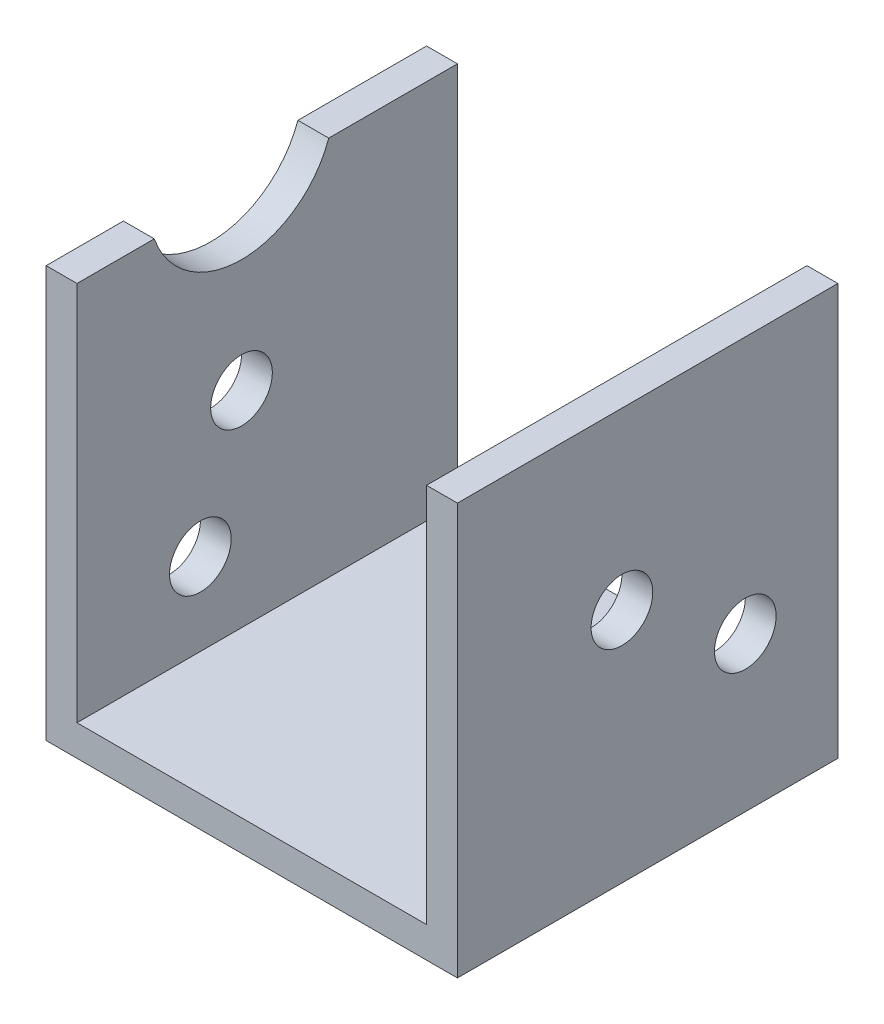
ISO-10303-21;
HEADER;
FILE_DESCRIPTION(('STEP AP214'),'2;1');
FILE_NAME('part.step','',(''),(''),'','','');
FILE_SCHEMA(('AUTOMOTIVE_DESIGN { 1 0 10303 214 1 1 1 1 }'));
ENDSEC;
DATA;
#1=APPLICATION_CONTEXT('core data for automotive mechanical design processes');
#2=APPLICATION_PROTOCOL_DEFINITION('international standard','automotive_design',2000,#1);
#3=PRODUCT_CONTEXT('',#1,'mechanical');
#4=PRODUCT('Part','Part','',(#3));
#5=PRODUCT_RELATED_PRODUCT_CATEGORY('part','',(#4));
#6=PRODUCT_DEFINITION_FORMATION('','',#4);
#7=PRODUCT_DEFINITION_CONTEXT('part definition',#1,'design');
#8=PRODUCT_DEFINITION('design','',#6,#7);
#9=PRODUCT_DEFINITION_SHAPE('','',#8);
#10=(LENGTH_UNIT() NAMED_UNIT(*) SI_UNIT(.MILLI.,.METRE.));
#11=(NAMED_UNIT(*) PLANE_ANGLE_UNIT() SI_UNIT($,.RADIAN.));
#12=(NAMED_UNIT(*) SI_UNIT($,.STERADIAN.) SOLID_ANGLE_UNIT());
#13=UNCERTAINTY_MEASURE_WITH_UNIT(LENGTH_MEASURE(1.E-05),#10,'distance_accuracy_value','');
#14=(GEOMETRIC_REPRESENTATION_CONTEXT(3) GLOBAL_UNCERTAINTY_ASSIGNED_CONTEXT((#13)) GLOBAL_UNIT_ASSIGNED_CONTEXT((#10,
#11,#12)) REPRESENTATION_CONTEXT('',''));
#15=CARTESIAN_POINT('',(0.,0.,0.));
#16=DIRECTION('',(0.,0.,1.));
#17=DIRECTION('',(1.,0.,0.));
#18=AXIS2_PLACEMENT_3D('',#15,#16,#17);
#19=CARTESIAN_POINT('',(-15.1362653272042,18.6355789473684,18.5));
#20=DIRECTION('',(0.,-1.,0.));
#21=DIRECTION('',(0.,0.,-1.));
#22=AXIS2_PLACEMENT_3D('',#19,#20,#21);
#23=PLANE('',#22);
#24=DIRECTION('',(0.,0.,-1.));
#25=VECTOR('',#24,1.);
#26=CARTESIAN_POINT('',(-15.1362653272042,18.6355789473684,18.5));
#27=LINE('',#26,#25);
#28=CARTESIAN_POINT('',(-15.1362653272042,18.6355789473684,18.5));
#29=VERTEX_POINT('',#28);
#30=CARTESIAN_POINT('',(-15.1362653272042,18.6355789473684,14.7426406871193));
#31=VERTEX_POINT('',#30);
#32=EDGE_CURVE('E159',#29,#31,#27,.T.);
#33=ORIENTED_EDGE('',*,*,#32,.T.);
#34=DIRECTION('',(-1.,0.,0.));
#35=VECTOR('',#34,1.);
#36=CARTESIAN_POINT('',(-11.6362653272042,18.6355789473684,14.7426406871193));
#37=LINE('',#36,#35);
#38=CARTESIAN_POINT('',(-16.6362653272042,18.6355789473684,14.7426406871193));
#39=VERTEX_POINT('',#38);
#40=EDGE_CURVE('E48',#31,#39,#37,.T.);
#41=ORIENTED_EDGE('',*,*,#40,.T.);
#42=DIRECTION('',(0.,0.,-1.));
#43=VECTOR('',#42,1.);
#44=CARTESIAN_POINT('',(-16.6362653272042,18.6355789473684,18.5));
#45=LINE('',#44,#43);
#46=CARTESIAN_POINT('',(-16.6362653272042,18.6355789473684,18.5));
#47=VERTEX_POINT('',#46);
#48=EDGE_CURVE('E40',#47,#39,#45,.T.);
#49=ORIENTED_EDGE('',*,*,#48,.F.);
#50=DIRECTION('',(-1.,0.,0.));
#51=VECTOR('',#50,1.);
#52=CARTESIAN_POINT('',(-15.1362653272042,18.6355789473684,18.5));
#53=LINE('',#52,#51);
#54=EDGE_CURVE('E158',#29,#47,#53,.T.);
#55=ORIENTED_EDGE('',*,*,#54,.F.);
#56=EDGE_LOOP('',(#33,#41,#49,#55));
#57=FACE_BOUND('',#56,.T.);
#58=ADVANCED_FACE('F31',(#57),#23,.F.);
#59=CARTESIAN_POINT('',(-16.6362653272042,18.6355789473684,6.25735931288071));
#60=VERTEX_POINT('',#59);
#61=CARTESIAN_POINT('',(-16.6362653272042,18.6355789473684,0.));
#62=VERTEX_POINT('',#61);
#63=EDGE_CURVE('E173',#60,#62,#45,.T.);
#64=ORIENTED_EDGE('',*,*,#63,.F.);
#65=DIRECTION('',(-1.,0.,0.));
#66=VECTOR('',#65,1.);
#67=CARTESIAN_POINT('',(-11.6362653272042,18.6355789473684,6.25735931288071));
#68=LINE('',#67,#66);
#69=CARTESIAN_POINT('',(-15.1362653272042,18.6355789473684,6.25735931288071));
#70=VERTEX_POINT('',#69);
#71=EDGE_CURVE('E183',#60,#70,#68,.F.);
#72=ORIENTED_EDGE('',*,*,#71,.T.);
#73=CARTESIAN_POINT('',(-15.1362653272042,18.6355789473684,0.));
#74=VERTEX_POINT('',#73);
#75=EDGE_CURVE('E90',#70,#74,#27,.T.);
#76=ORIENTED_EDGE('',*,*,#75,.T.);
#77=DIRECTION('',(-1.,0.,0.));
#78=VECTOR('',#77,1.);
#79=CARTESIAN_POINT('',(-15.1362653272042,18.6355789473684,0.));
#80=LINE('',#79,#78);
#81=EDGE_CURVE('E142',#74,#62,#80,.T.);
#82=ORIENTED_EDGE('',*,*,#81,.T.);
#83=EDGE_LOOP('',(#64,#72,#76,#82));
#84=FACE_BOUND('',#83,.T.);
#85=ADVANCED_FACE('F33',(#84),#23,.F.);
#86=CARTESIAN_POINT('',(-16.6362653272042,18.6355789473684,18.5));
#87=DIRECTION('',(1.,0.,0.));
#88=DIRECTION('',(0.,1.,0.));
#89=AXIS2_PLACEMENT_3D('',#86,#87,#88);
#90=PLANE('',#89);
#91=CARTESIAN_POINT('',(-16.6362653272042,10.1355789473684,10.5));
#92=DIRECTION('',(-1.,0.,0.));
#93=DIRECTION('',(0.,-1.,0.));
#94=AXIS2_PLACEMENT_3D('',#91,#92,#93);
#95=CIRCLE('',#94,1.5);
#96=CARTESIAN_POINT('',(-16.6362653272042,8.63557894736843,10.5));
#97=VERTEX_POINT('',#96);
#98=EDGE_CURVE('E361',#97,#97,#95,.T.);
#99=ORIENTED_EDGE('',*,*,#98,.F.);
#100=EDGE_LOOP('',(#99));
#101=FACE_BOUND('',#100,.T.);
#102=CARTESIAN_POINT('',(-16.6362653272042,4.13557894736843,12.5));
#103=DIRECTION('',(-1.,0.,0.));
#104=DIRECTION('',(0.,-1.,0.));
#105=AXIS2_PLACEMENT_3D('',#102,#103,#104);
#106=CIRCLE('',#105,1.5);
#107=CARTESIAN_POINT('',(-16.6362653272042,2.63557894736843,12.5));
#108=VERTEX_POINT('',#107);
#109=EDGE_CURVE('E180',#108,#108,#106,.T.);
#110=ORIENTED_EDGE('',*,*,#109,.F.);
#111=EDGE_LOOP('',(#110));
#112=FACE_BOUND('',#111,.T.);
#113=ORIENTED_EDGE('',*,*,#48,.T.);
#114=CARTESIAN_POINT('',(-16.6362653272042,20.1355789473684,10.5));
#115=DIRECTION('',(-1.,0.,0.));
#116=DIRECTION('',(0.,-1.,0.));
#117=AXIS2_PLACEMENT_3D('',#114,#115,#116);
#118=CIRCLE('',#117,4.5);
#119=EDGE_CURVE('E179',#60,#39,#118,.T.);
#120=ORIENTED_EDGE('',*,*,#119,.F.);
#121=ORIENTED_EDGE('',*,*,#63,.T.);
#122=DIRECTION('',(0.,-1.,0.));
#123=VECTOR('',#122,1.);
#124=CARTESIAN_POINT('',(-16.6362653272042,18.6355789473684,0.));
#125=LINE('',#124,#123);
#126=CARTESIAN_POINT('',(-16.6362653272042,-1.36442105263157,0.));
#127=VERTEX_POINT('',#126);
#128=EDGE_CURVE('E144',#62,#127,#125,.T.);
#129=ORIENTED_EDGE('',*,*,#128,.T.);
#130=DIRECTION('',(0.,0.,-1.));
#131=VECTOR('',#130,1.);
#132=CARTESIAN_POINT('',(-16.6362653272042,-1.36442105263157,18.5));
#133=LINE('',#132,#131);
#134=CARTESIAN_POINT('',(-16.6362653272042,-1.36442105263157,18.5));
#135=VERTEX_POINT('',#134);
#136=EDGE_CURVE('E170',#135,#127,#133,.T.);
#137=ORIENTED_EDGE('',*,*,#136,.F.);
#138=DIRECTION('',(0.,-1.,0.));
#139=VECTOR('',#138,1.);
#140=CARTESIAN_POINT('',(-16.6362653272042,18.6355789473684,18.5));
#141=LINE('',#140,#139);
#142=EDGE_CURVE('E99',#47,#135,#141,.T.);
#143=ORIENTED_EDGE('',*,*,#142,.F.);
#144=EDGE_LOOP('',(#113,#120,#121,#129,#137,#143));
#145=FACE_BOUND('',#144,.T.);
#146=ADVANCED_FACE('F222',(#101,#112,#145),#90,.F.);
#147=CARTESIAN_POINT('',(-16.6362653272042,-1.36442105263157,18.5));
#148=DIRECTION('',(0.,1.,0.));
#149=DIRECTION('',(0.,0.,1.));
#150=AXIS2_PLACEMENT_3D('',#147,#148,#149);
#151=PLANE('',#150);
#152=DIRECTION('',(1.,0.,0.));
#153=VECTOR('',#152,1.);
#154=CARTESIAN_POINT('',(-16.6362653272042,-1.36442105263157,0.));
#155=LINE('',#154,#153);
#156=CARTESIAN_POINT('',(3.36373467279582,-1.36442105263157,0.));
#157=VERTEX_POINT('',#156);
#158=EDGE_CURVE('E147',#127,#157,#155,.T.);
#159=ORIENTED_EDGE('',*,*,#158,.T.);
#160=DIRECTION('',(0.,0.,-1.));
#161=VECTOR('',#160,1.);
#162=CARTESIAN_POINT('',(3.36373467279582,-1.36442105263157,18.5));
#163=LINE('',#162,#161);
#164=CARTESIAN_POINT('',(3.36373467279582,-1.36442105263157,18.5));
#165=VERTEX_POINT('',#164);
#166=EDGE_CURVE('E167',#165,#157,#163,.T.);
#167=ORIENTED_EDGE('',*,*,#166,.F.);
#168=DIRECTION('',(1.,0.,0.));
#169=VECTOR('',#168,1.);
#170=CARTESIAN_POINT('',(-16.6362653272042,-1.36442105263157,18.5));
#171=LINE('',#170,#169);
#172=EDGE_CURVE('E200',#135,#165,#171,.T.);
#173=ORIENTED_EDGE('',*,*,#172,.F.);
#174=ORIENTED_EDGE('',*,*,#136,.T.);
#175=EDGE_LOOP('',(#159,#167,#173,#174));
#176=FACE_BOUND('',#175,.T.);
#177=ADVANCED_FACE('F226',(#176),#151,.F.);
#178=CARTESIAN_POINT('',(3.36373467279582,-1.36442105263157,18.5));
#179=DIRECTION('',(-1.,0.,0.));
#180=DIRECTION('',(0.,0.,1.));
#181=AXIS2_PLACEMENT_3D('',#178,#179,#180);
#182=PLANE('',#181);
#183=CARTESIAN_POINT('',(3.36373467279582,10.1355789473684,10.5));
#184=DIRECTION('',(-1.,0.,0.));
#185=DIRECTION('',(0.,-1.,0.));
#186=AXIS2_PLACEMENT_3D('',#183,#184,#185);
#187=CIRCLE('',#186,1.5);
#188=CARTESIAN_POINT('',(3.36373467279582,8.63557894736844,10.5));
#189=VERTEX_POINT('',#188);
#190=EDGE_CURVE('E356',#189,#189,#187,.T.);
#191=ORIENTED_EDGE('',*,*,#190,.T.);
#192=EDGE_LOOP('',(#191));
#193=FACE_BOUND('',#192,.T.);
#194=CARTESIAN_POINT('',(3.36373467279582,6.13557894736843,4.5));
#195=DIRECTION('',(1.,0.,0.));
#196=DIRECTION('',(0.,0.,-1.));
#197=AXIS2_PLACEMENT_3D('',#194,#195,#196);
#198=CIRCLE('',#197,1.5);
#199=CARTESIAN_POINT('',(3.36373467279582,6.13557894736843,3.));
#200=VERTEX_POINT('',#199);
#201=EDGE_CURVE('E176',#200,#200,#198,.T.);
#202=ORIENTED_EDGE('',*,*,#201,.F.);
#203=EDGE_LOOP('',(#202));
#204=FACE_BOUND('',#203,.T.);
#205=DIRECTION('',(0.,1.,0.));
#206=VECTOR('',#205,1.);
#207=CARTESIAN_POINT('',(3.36373467279582,-1.36442105263157,0.));
#208=LINE('',#207,#206);
#209=CARTESIAN_POINT('',(3.36373467279582,18.6355789473684,0.));
#210=VERTEX_POINT('',#209);
#211=EDGE_CURVE('E149',#157,#210,#208,.T.);
#212=ORIENTED_EDGE('',*,*,#211,.T.);
#213=DIRECTION('',(0.,0.,-1.));
#214=VECTOR('',#213,1.);
#215=CARTESIAN_POINT('',(3.36373467279582,18.6355789473684,18.5));
#216=LINE('',#215,#214);
#217=CARTESIAN_POINT('',(3.36373467279582,18.6355789473684,18.5));
#218=VERTEX_POINT('',#217);
#219=EDGE_CURVE('E164',#218,#210,#216,.T.);
#220=ORIENTED_EDGE('',*,*,#219,.F.);
#221=DIRECTION('',(0.,1.,0.));
#222=VECTOR('',#221,1.);
#223=CARTESIAN_POINT('',(3.36373467279582,-1.36442105263157,18.5));
#224=LINE('',#223,#222);
#225=EDGE_CURVE('E202',#165,#218,#224,.T.);
#226=ORIENTED_EDGE('',*,*,#225,.F.);
#227=ORIENTED_EDGE('',*,*,#166,.T.);
#228=EDGE_LOOP('',(#212,#220,#226,#227));
#229=FACE_BOUND('',#228,.T.);
#230=ADVANCED_FACE('F208',(#193,#204,#229),#182,.F.);
#231=CARTESIAN_POINT('',(3.36373467279582,18.6355789473684,18.5));
#232=DIRECTION('',(0.,-1.,0.));
#233=DIRECTION('',(0.,0.,-1.));
#234=AXIS2_PLACEMENT_3D('',#231,#232,#233);
#235=PLANE('',#234);
#236=DIRECTION('',(-1.,0.,0.));
#237=VECTOR('',#236,1.);
#238=CARTESIAN_POINT('',(3.36373467279582,18.6355789473684,0.));
#239=LINE('',#238,#237);
#240=CARTESIAN_POINT('',(1.86373467279582,18.6355789473684,0.));
#241=VERTEX_POINT('',#240);
#242=EDGE_CURVE('E151',#210,#241,#239,.T.);
#243=ORIENTED_EDGE('',*,*,#242,.T.);
#244=DIRECTION('',(0.,0.,-1.));
#245=VECTOR('',#244,1.);
#246=CARTESIAN_POINT('',(1.86373467279582,18.6355789473684,18.5));
#247=LINE('',#246,#245);
#248=CARTESIAN_POINT('',(1.86373467279582,18.6355789473684,18.5));
#249=VERTEX_POINT('',#248);
#250=EDGE_CURVE('E133',#249,#241,#247,.T.);
#251=ORIENTED_EDGE('',*,*,#250,.F.);
#252=DIRECTION('',(-1.,0.,0.));
#253=VECTOR('',#252,1.);
#254=CARTESIAN_POINT('',(3.36373467279582,18.6355789473684,18.5));
#255=LINE('',#254,#253);
#256=EDGE_CURVE('E121',#218,#249,#255,.T.);
#257=ORIENTED_EDGE('',*,*,#256,.F.);
#258=ORIENTED_EDGE('',*,*,#219,.T.);
#259=EDGE_LOOP('',(#243,#251,#257,#258));
#260=FACE_BOUND('',#259,.T.);
#261=ADVANCED_FACE('F212',(#260),#235,.F.);
#262=CARTESIAN_POINT('',(1.86373467279582,18.6355789473684,18.5));
#263=DIRECTION('',(1.,0.,0.));
#264=DIRECTION('',(0.,1.,0.));
#265=AXIS2_PLACEMENT_3D('',#262,#263,#264);
#266=PLANE('',#265);
#267=CARTESIAN_POINT('',(1.86373467279582,10.1355789473684,10.5));
#268=DIRECTION('',(1.,0.,0.));
#269=DIRECTION('',(0.,1.,0.));
#270=AXIS2_PLACEMENT_3D('',#267,#268,#269);
#271=CIRCLE('',#270,1.5);
#272=CARTESIAN_POINT('',(1.86373467279582,8.63557894736844,10.5));
#273=VERTEX_POINT('',#272);
#274=EDGE_CURVE('E186',#273,#273,#271,.T.);
#275=ORIENTED_EDGE('',*,*,#274,.T.);
#276=EDGE_LOOP('',(#275));
#277=FACE_BOUND('',#276,.T.);
#278=CARTESIAN_POINT('',(1.86373467279582,6.13557894736843,4.5));
#279=DIRECTION('',(1.,0.,0.));
#280=DIRECTION('',(0.,1.,0.));
#281=AXIS2_PLACEMENT_3D('',#278,#279,#280);
#282=CIRCLE('',#281,1.5);
#283=CARTESIAN_POINT('',(1.86373467279582,7.63557894736843,4.5));
#284=VERTEX_POINT('',#283);
#285=EDGE_CURVE('E145',#284,#284,#282,.T.);
#286=ORIENTED_EDGE('',*,*,#285,.T.);
#287=EDGE_LOOP('',(#286));
#288=FACE_BOUND('',#287,.T.);
#289=DIRECTION('',(0.,-1.,0.));
#290=VECTOR('',#289,1.);
#291=CARTESIAN_POINT('',(1.86373467279582,18.6355789473684,0.));
#292=LINE('',#291,#290);
#293=CARTESIAN_POINT('',(1.86373467279582,0.135578947368434,0.));
#294=VERTEX_POINT('',#293);
#295=EDGE_CURVE('E130',#241,#294,#292,.T.);
#296=ORIENTED_EDGE('',*,*,#295,.T.);
#297=DIRECTION('',(0.,0.,-1.));
#298=VECTOR('',#297,1.);
#299=CARTESIAN_POINT('',(1.86373467279582,0.135578947368434,18.5));
#300=LINE('',#299,#298);
#301=CARTESIAN_POINT('',(1.86373467279582,0.135578947368434,18.5));
#302=VERTEX_POINT('',#301);
#303=EDGE_CURVE('E127',#302,#294,#300,.T.);
#304=ORIENTED_EDGE('',*,*,#303,.F.);
#305=DIRECTION('',(0.,-1.,0.));
#306=VECTOR('',#305,1.);
#307=CARTESIAN_POINT('',(1.86373467279582,18.6355789473684,18.5));
#308=LINE('',#307,#306);
#309=EDGE_CURVE('E114',#249,#302,#308,.T.);
#310=ORIENTED_EDGE('',*,*,#309,.F.);
#311=ORIENTED_EDGE('',*,*,#250,.T.);
#312=EDGE_LOOP('',(#296,#304,#310,#311));
#313=FACE_BOUND('',#312,.T.);
#314=ADVANCED_FACE('F128',(#277,#288,#313),#266,.F.);
#315=CARTESIAN_POINT('',(1.86373467279582,0.135578947368434,18.5));
#316=DIRECTION('',(0.,-1.,0.));
#317=DIRECTION('',(1.,0.,0.));
#318=AXIS2_PLACEMENT_3D('',#315,#316,#317);
#319=PLANE('',#318);
#320=DIRECTION('',(-1.,0.,0.));
#321=VECTOR('',#320,1.);
#322=CARTESIAN_POINT('',(1.86373467279582,0.135578947368434,0.));
#323=LINE('',#322,#321);
#324=CARTESIAN_POINT('',(-15.1362653272042,0.135578947368431,0.));
#325=VERTEX_POINT('',#324);
#326=EDGE_CURVE('E154',#294,#325,#323,.T.);
#327=ORIENTED_EDGE('',*,*,#326,.T.);
#328=DIRECTION('',(0.,0.,-1.));
#329=VECTOR('',#328,1.);
#330=CARTESIAN_POINT('',(-15.1362653272042,0.135578947368431,18.5));
#331=LINE('',#330,#329);
#332=CARTESIAN_POINT('',(-15.1362653272042,0.135578947368431,18.5));
#333=VERTEX_POINT('',#332);
#334=EDGE_CURVE('E134',#333,#325,#331,.T.);
#335=ORIENTED_EDGE('',*,*,#334,.F.);
#336=DIRECTION('',(-1.,0.,0.));
#337=VECTOR('',#336,1.);
#338=CARTESIAN_POINT('',(1.86373467279582,0.135578947368434,18.5));
#339=LINE('',#338,#337);
#340=EDGE_CURVE('E118',#302,#333,#339,.T.);
#341=ORIENTED_EDGE('',*,*,#340,.F.);
#342=ORIENTED_EDGE('',*,*,#303,.T.);
#343=EDGE_LOOP('',(#327,#335,#341,#342));
#344=FACE_BOUND('',#343,.T.);
#345=ADVANCED_FACE('F136',(#344),#319,.F.);
#346=CARTESIAN_POINT('',(-15.1362653272042,0.135578947368431,18.5));
#347=DIRECTION('',(-1.,0.,0.));
#348=DIRECTION('',(0.,-1.,0.));
#349=AXIS2_PLACEMENT_3D('',#346,#347,#348);
#350=PLANE('',#349);
#351=CARTESIAN_POINT('',(-15.1362653272042,10.1355789473684,10.5));
#352=DIRECTION('',(-1.,0.,0.));
#353=DIRECTION('',(0.,-1.,0.));
#354=AXIS2_PLACEMENT_3D('',#351,#352,#353);
#355=CIRCLE('',#354,1.5);
#356=CARTESIAN_POINT('',(-15.1362653272042,8.63557894736843,10.5));
#357=VERTEX_POINT('',#356);
#358=EDGE_CURVE('E35',#357,#357,#355,.T.);
#359=ORIENTED_EDGE('',*,*,#358,.T.);
#360=EDGE_LOOP('',(#359));
#361=FACE_BOUND('',#360,.T.);
#362=CARTESIAN_POINT('',(-15.1362653272042,4.13557894736843,12.5));
#363=DIRECTION('',(-1.,0.,0.));
#364=DIRECTION('',(0.,-1.,0.));
#365=AXIS2_PLACEMENT_3D('',#362,#363,#364);
#366=CIRCLE('',#365,1.5);
#367=CARTESIAN_POINT('',(-15.1362653272042,2.63557894736843,12.5));
#368=VERTEX_POINT('',#367);
#369=EDGE_CURVE('E177',#368,#368,#366,.T.);
#370=ORIENTED_EDGE('',*,*,#369,.T.);
#371=EDGE_LOOP('',(#370));
#372=FACE_BOUND('',#371,.T.);
#373=ORIENTED_EDGE('',*,*,#75,.F.);
#374=CARTESIAN_POINT('',(-15.1362653272042,20.1355789473684,10.5));
#375=DIRECTION('',(-1.,0.,0.));
#376=DIRECTION('',(0.,-1.,0.));
#377=AXIS2_PLACEMENT_3D('',#374,#375,#376);
#378=CIRCLE('',#377,4.5);
#379=EDGE_CURVE('E11',#70,#31,#378,.T.);
#380=ORIENTED_EDGE('',*,*,#379,.T.);
#381=ORIENTED_EDGE('',*,*,#32,.F.);
#382=DIRECTION('',(0.,1.,0.));
#383=VECTOR('',#382,1.);
#384=CARTESIAN_POINT('',(-15.1362653272042,0.135578947368431,18.5));
#385=LINE('',#384,#383);
#386=EDGE_CURVE('E56',#333,#29,#385,.T.);
#387=ORIENTED_EDGE('',*,*,#386,.F.);
#388=ORIENTED_EDGE('',*,*,#334,.T.);
#389=DIRECTION('',(0.,1.,0.));
#390=VECTOR('',#389,1.);
#391=CARTESIAN_POINT('',(-15.1362653272042,0.135578947368431,0.));
#392=LINE('',#391,#390);
#393=EDGE_CURVE('E156',#325,#74,#392,.T.);
#394=ORIENTED_EDGE('',*,*,#393,.T.);
#395=EDGE_LOOP('',(#373,#380,#381,#387,#388,#394));
#396=FACE_BOUND('',#395,.T.);
#397=ADVANCED_FACE('F218',(#361,#372,#396),#350,.F.);
#398=CARTESIAN_POINT('',(-16.6362653272042,18.6355789473684,18.5));
#399=DIRECTION('',(0.,0.,1.));
#400=DIRECTION('',(1.,0.,0.));
#401=AXIS2_PLACEMENT_3D('',#398,#399,#400);
#402=PLANE('',#401);
#403=ORIENTED_EDGE('',*,*,#54,.T.);
#404=ORIENTED_EDGE('',*,*,#142,.T.);
#405=ORIENTED_EDGE('',*,*,#172,.T.);
#406=ORIENTED_EDGE('',*,*,#225,.T.);
#407=ORIENTED_EDGE('',*,*,#256,.T.);
#408=ORIENTED_EDGE('',*,*,#309,.T.);
#409=ORIENTED_EDGE('',*,*,#340,.T.);
#410=ORIENTED_EDGE('',*,*,#386,.T.);
#411=EDGE_LOOP('',(#403,#404,#405,#406,#407,#408,#409,#410));
#412=FACE_BOUND('',#411,.T.);
#413=ADVANCED_FACE('F116',(#412),#402,.T.);
#414=CARTESIAN_POINT('',(-16.6362653272042,18.6355789473684,0.));
#415=DIRECTION('',(0.,0.,1.));
#416=DIRECTION('',(1.,0.,0.));
#417=AXIS2_PLACEMENT_3D('',#414,#415,#416);
#418=PLANE('',#417);
#419=ORIENTED_EDGE('',*,*,#81,.F.);
#420=ORIENTED_EDGE('',*,*,#393,.F.);
#421=ORIENTED_EDGE('',*,*,#326,.F.);
#422=ORIENTED_EDGE('',*,*,#295,.F.);
#423=ORIENTED_EDGE('',*,*,#242,.F.);
#424=ORIENTED_EDGE('',*,*,#211,.F.);
#425=ORIENTED_EDGE('',*,*,#158,.F.);
#426=ORIENTED_EDGE('',*,*,#128,.F.);
#427=EDGE_LOOP('',(#419,#420,#421,#422,#423,#424,#425,#426));
#428=FACE_BOUND('',#427,.T.);
#429=ADVANCED_FACE('F215',(#428),#418,.F.);
#430=CARTESIAN_POINT('',(-1.63626532720418,6.13557894736843,4.5));
#431=DIRECTION('',(1.,0.,0.));
#432=DIRECTION('',(0.,0.,-1.));
#433=AXIS2_PLACEMENT_3D('',#430,#431,#432);
#434=CYLINDRICAL_SURFACE('',#433,1.5);
#435=ORIENTED_EDGE('',*,*,#201,.T.);
#436=EDGE_LOOP('',(#435));
#437=FACE_BOUND('',#436,.T.);
#438=ORIENTED_EDGE('',*,*,#285,.F.);
#439=EDGE_LOOP('',(#438));
#440=FACE_BOUND('',#439,.T.);
#441=ADVANCED_FACE('F236',(#437,#440),#434,.F.);
#442=CARTESIAN_POINT('',(-11.6362653272042,20.1355789473684,10.5));
#443=DIRECTION('',(-1.,0.,0.));
#444=DIRECTION('',(0.,-1.,0.));
#445=AXIS2_PLACEMENT_3D('',#442,#443,#444);
#446=CYLINDRICAL_SURFACE('',#445,4.5);
#447=ORIENTED_EDGE('',*,*,#379,.F.);
#448=ORIENTED_EDGE('',*,*,#71,.F.);
#449=ORIENTED_EDGE('',*,*,#119,.T.);
#450=ORIENTED_EDGE('',*,*,#40,.F.);
#451=EDGE_LOOP('',(#447,#448,#449,#450));
#452=FACE_BOUND('',#451,.T.);
#453=ADVANCED_FACE('F232',(#452),#446,.F.);
#454=CARTESIAN_POINT('',(-11.6362653272042,4.13557894736843,12.5));
#455=DIRECTION('',(-1.,0.,0.));
#456=DIRECTION('',(0.,-1.,0.));
#457=AXIS2_PLACEMENT_3D('',#454,#455,#456);
#458=CYLINDRICAL_SURFACE('',#457,1.5);
#459=ORIENTED_EDGE('',*,*,#109,.T.);
#460=EDGE_LOOP('',(#459));
#461=FACE_BOUND('',#460,.T.);
#462=ORIENTED_EDGE('',*,*,#369,.F.);
#463=EDGE_LOOP('',(#462));
#464=FACE_BOUND('',#463,.T.);
#465=ADVANCED_FACE('F235',(#461,#464),#458,.F.);
#466=CARTESIAN_POINT('',(3.36373467279582,10.1355789473684,10.5));
#467=DIRECTION('',(-1.,0.,0.));
#468=DIRECTION('',(0.,-1.,0.));
#469=AXIS2_PLACEMENT_3D('',#466,#467,#468);
#470=CYLINDRICAL_SURFACE('',#469,1.5);
#471=CARTESIAN_POINT('',(-16.6362653272042,8.63557894736843,10.5));
#472=CARTESIAN_POINT('',(-16.6206403272042,8.63557894736843,10.5));
#473=CARTESIAN_POINT('',(-16.6050153272042,8.63557894736843,10.5));
#474=CARTESIAN_POINT('',(-16.5737653272042,8.63557894736843,10.5));
#475=CARTESIAN_POINT('',(-16.5581403272042,8.63557894736843,10.5));
#476=CARTESIAN_POINT('',(-16.5268903272042,8.63557894736843,10.5));
#477=CARTESIAN_POINT('',(-16.5112653272042,8.63557894736843,10.5));
#478=CARTESIAN_POINT('',(-16.4800153272042,8.63557894736843,10.5));
#479=CARTESIAN_POINT('',(-16.4643903272042,8.63557894736843,10.5));
#480=CARTESIAN_POINT('',(-16.4331403272042,8.63557894736843,10.5));
#481=CARTESIAN_POINT('',(-16.4175153272042,8.63557894736843,10.5));
#482=CARTESIAN_POINT('',(-16.3862653272042,8.63557894736843,10.5));
#483=CARTESIAN_POINT('',(-16.3706403272042,8.63557894736843,10.5));
#484=CARTESIAN_POINT('',(-16.3393903272042,8.63557894736843,10.5));
#485=CARTESIAN_POINT('',(-16.3237653272042,8.63557894736843,10.5));
#486=CARTESIAN_POINT('',(-16.2925153272042,8.63557894736843,10.5));
#487=CARTESIAN_POINT('',(-16.2768903272042,8.63557894736843,10.5));
#488=CARTESIAN_POINT('',(-16.2456403272042,8.63557894736843,10.5));
#489=CARTESIAN_POINT('',(-16.2300153272042,8.63557894736843,10.5));
#490=CARTESIAN_POINT('',(-16.1987653272042,8.63557894736843,10.5));
#491=CARTESIAN_POINT('',(-16.1831403272042,8.63557894736843,10.5));
#492=CARTESIAN_POINT('',(-16.1518903272042,8.63557894736843,10.5));
#493=CARTESIAN_POINT('',(-16.1362653272042,8.63557894736843,10.5));
#494=CARTESIAN_POINT('',(-16.1050153272042,8.63557894736843,10.5));
#495=CARTESIAN_POINT('',(-16.0893903272042,8.63557894736843,10.5));
#496=CARTESIAN_POINT('',(-16.0581403272042,8.63557894736843,10.5));
#497=CARTESIAN_POINT('',(-16.0425153272042,8.63557894736843,10.5));
#498=CARTESIAN_POINT('',(-16.0112653272042,8.63557894736843,10.5));
#499=CARTESIAN_POINT('',(-15.9956403272042,8.63557894736843,10.5));
#500=CARTESIAN_POINT('',(-15.9643903272042,8.63557894736843,10.5));
#501=CARTESIAN_POINT('',(-15.9487653272042,8.63557894736843,10.5));
#502=CARTESIAN_POINT('',(-15.9175153272042,8.63557894736843,10.5));
#503=CARTESIAN_POINT('',(-15.9018903272042,8.63557894736843,10.5));
#504=CARTESIAN_POINT('',(-15.8706403272042,8.63557894736843,10.5));
#505=CARTESIAN_POINT('',(-15.8550153272042,8.63557894736843,10.5));
#506=CARTESIAN_POINT('',(-15.8237653272042,8.63557894736843,10.5));
#507=CARTESIAN_POINT('',(-15.8081403272042,8.63557894736843,10.5));
#508=CARTESIAN_POINT('',(-15.7768903272042,8.63557894736843,10.5));
#509=CARTESIAN_POINT('',(-15.7612653272042,8.63557894736843,10.5));
#510=CARTESIAN_POINT('',(-15.7300153272042,8.63557894736843,10.5));
#511=CARTESIAN_POINT('',(-15.7143903272042,8.63557894736843,10.5));
#512=CARTESIAN_POINT('',(-15.6831403272042,8.63557894736843,10.5));
#513=CARTESIAN_POINT('',(-15.6675153272042,8.63557894736843,10.5));
#514=CARTESIAN_POINT('',(-15.6362653272042,8.63557894736843,10.5));
#515=CARTESIAN_POINT('',(-15.6206403272042,8.63557894736843,10.5));
#516=CARTESIAN_POINT('',(-15.5893903272042,8.63557894736843,10.5));
#517=CARTESIAN_POINT('',(-15.5737653272042,8.63557894736843,10.5));
#518=CARTESIAN_POINT('',(-15.5425153272042,8.63557894736843,10.5));
#519=CARTESIAN_POINT('',(-15.5268903272042,8.63557894736843,10.5));
#520=CARTESIAN_POINT('',(-15.4956403272042,8.63557894736843,10.5));
#521=CARTESIAN_POINT('',(-15.4800153272042,8.63557894736843,10.5));
#522=CARTESIAN_POINT('',(-15.4487653272042,8.63557894736843,10.5));
#523=CARTESIAN_POINT('',(-15.4331403272042,8.63557894736843,10.5));
#524=CARTESIAN_POINT('',(-15.4018903272042,8.63557894736843,10.5));
#525=CARTESIAN_POINT('',(-15.3862653272042,8.63557894736843,10.5));
#526=CARTESIAN_POINT('',(-15.3550153272042,8.63557894736843,10.5));
#527=CARTESIAN_POINT('',(-15.3393903272042,8.63557894736843,10.5));
#528=CARTESIAN_POINT('',(-15.3081403272042,8.63557894736843,10.5));
#529=CARTESIAN_POINT('',(-15.2925153272042,8.63557894736843,10.5));
#530=CARTESIAN_POINT('',(-15.2612653272042,8.63557894736843,10.5));
#531=CARTESIAN_POINT('',(-15.2456403272042,8.63557894736843,10.5));
#532=CARTESIAN_POINT('',(-15.2143903272042,8.63557894736843,10.5));
#533=CARTESIAN_POINT('',(-15.1987653272042,8.63557894736843,10.5));
#534=CARTESIAN_POINT('',(-15.1675153272042,8.63557894736843,10.5));
#535=CARTESIAN_POINT('',(-15.1518903272042,8.63557894736843,10.5));
#536=CARTESIAN_POINT('',(-15.1362653272042,8.63557894736843,10.5));
#537=B_SPLINE_CURVE_WITH_KNOTS('',3,(#471,#472,#473,#474,#475,#476,#477,#478,#479,#480,#481,
#482,#483,#484,#485,#486,#487,#488,#489,#490,#491,#492,#493,#494,#495,#496,#497,#498,#499,#500,
#501,#502,#503,#504,#505,#506,#507,#508,#509,#510,#511,#512,#513,#514,#515,#516,#517,#518,#519,
#520,#521,#522,#523,#524,#525,#526,#527,#528,#529,#530,#531,#532,#533,#534,#535,#536),
.UNSPECIFIED.,.F.,.F.,(4,2,2,2,2,2,2,2,2,2,2,2,2,2,2,2,2,2,2,2,2,2,2,2,2,2,2,2,2,2,2,2,4),(0.,
0.0468749999999983,0.0937500000000001,0.140624999999998,0.1875,0.234374999999998,0.28125,
0.328124999999999,0.375,0.421874999999999,0.468749999999997,0.515624999999999,0.562499999999997,
0.609374999999999,0.656249999999997,0.703124999999999,0.749999999999997,0.796874999999996,
0.843749999999997,0.890624999999996,0.937499999999997,0.984374999999996,1.03125,1.078125,
1.12499999999999,1.171875,1.21874999999999,1.265625,1.31249999999999,1.359375,1.40624999999999,
1.453125,1.49999999999999),.UNSPECIFIED.);
#538=EDGE_CURVE('BSEAM242',#97,#357,#537,.T.);
#539=ORIENTED_EDGE('',*,*,#98,.T.);
#540=ORIENTED_EDGE('',*,*,#358,.F.);
#541=ORIENTED_EDGE('',*,*,#538,.T.);
#542=ORIENTED_EDGE('',*,*,#538,.F.);
#543=EDGE_LOOP('',(#539,#541,#540,#542));
#544=FACE_BOUND('',#543,.T.);
#545=ADVANCED_FACE('F242',(#544),#470,.F.);
#546=CARTESIAN_POINT('',(3.36373467279582,8.63557894736844,10.5));
#547=CARTESIAN_POINT('',(3.34810967279582,8.63557894736844,10.5));
#548=CARTESIAN_POINT('',(3.33248467279582,8.63557894736844,10.5));
#549=CARTESIAN_POINT('',(3.30123467279582,8.63557894736844,10.5));
#550=CARTESIAN_POINT('',(3.28560967279582,8.63557894736844,10.5));
#551=CARTESIAN_POINT('',(3.25435967279582,8.63557894736844,10.5));
#552=CARTESIAN_POINT('',(3.23873467279582,8.63557894736844,10.5));
#553=CARTESIAN_POINT('',(3.20748467279582,8.63557894736844,10.5));
#554=CARTESIAN_POINT('',(3.19185967279582,8.63557894736844,10.5));
#555=CARTESIAN_POINT('',(3.16060967279582,8.63557894736844,10.5));
#556=CARTESIAN_POINT('',(3.14498467279582,8.63557894736844,10.5));
#557=CARTESIAN_POINT('',(3.11373467279582,8.63557894736844,10.5));
#558=CARTESIAN_POINT('',(3.09810967279582,8.63557894736844,10.5));
#559=CARTESIAN_POINT('',(3.06685967279582,8.63557894736844,10.5));
#560=CARTESIAN_POINT('',(3.05123467279582,8.63557894736844,10.5));
#561=CARTESIAN_POINT('',(3.01998467279582,8.63557894736844,10.5));
#562=CARTESIAN_POINT('',(3.00435967279582,8.63557894736844,10.5));
#563=CARTESIAN_POINT('',(2.97310967279582,8.63557894736844,10.5));
#564=CARTESIAN_POINT('',(2.95748467279582,8.63557894736844,10.5));
#565=CARTESIAN_POINT('',(2.92623467279582,8.63557894736844,10.5));
#566=CARTESIAN_POINT('',(2.91060967279582,8.63557894736844,10.5));
#567=CARTESIAN_POINT('',(2.87935967279582,8.63557894736844,10.5));
#568=CARTESIAN_POINT('',(2.86373467279582,8.63557894736844,10.5));
#569=CARTESIAN_POINT('',(2.83248467279582,8.63557894736844,10.5));
#570=CARTESIAN_POINT('',(2.81685967279582,8.63557894736844,10.5));
#571=CARTESIAN_POINT('',(2.78560967279582,8.63557894736844,10.5));
#572=CARTESIAN_POINT('',(2.76998467279582,8.63557894736844,10.5));
#573=CARTESIAN_POINT('',(2.73873467279582,8.63557894736844,10.5));
#574=CARTESIAN_POINT('',(2.72310967279582,8.63557894736844,10.5));
#575=CARTESIAN_POINT('',(2.69185967279582,8.63557894736844,10.5));
#576=CARTESIAN_POINT('',(2.67623467279582,8.63557894736844,10.5));
#577=CARTESIAN_POINT('',(2.64498467279582,8.63557894736844,10.5));
#578=CARTESIAN_POINT('',(2.62935967279582,8.63557894736844,10.5));
#579=CARTESIAN_POINT('',(2.59810967279582,8.63557894736844,10.5));
#580=CARTESIAN_POINT('',(2.58248467279582,8.63557894736844,10.5));
#581=CARTESIAN_POINT('',(2.55123467279582,8.63557894736844,10.5));
#582=CARTESIAN_POINT('',(2.53560967279582,8.63557894736844,10.5));
#583=CARTESIAN_POINT('',(2.50435967279582,8.63557894736844,10.5));
#584=CARTESIAN_POINT('',(2.48873467279582,8.63557894736844,10.5));
#585=CARTESIAN_POINT('',(2.45748467279582,8.63557894736844,10.5));
#586=CARTESIAN_POINT('',(2.44185967279582,8.63557894736844,10.5));
#587=CARTESIAN_POINT('',(2.41060967279582,8.63557894736844,10.5));
#588=CARTESIAN_POINT('',(2.39498467279582,8.63557894736844,10.5));
#589=CARTESIAN_POINT('',(2.36373467279582,8.63557894736844,10.5));
#590=CARTESIAN_POINT('',(2.34810967279582,8.63557894736844,10.5));
#591=CARTESIAN_POINT('',(2.31685967279582,8.63557894736844,10.5));
#592=CARTESIAN_POINT('',(2.30123467279582,8.63557894736844,10.5));
#593=CARTESIAN_POINT('',(2.26998467279582,8.63557894736844,10.5));
#594=CARTESIAN_POINT('',(2.25435967279582,8.63557894736844,10.5));
#595=CARTESIAN_POINT('',(2.22310967279582,8.63557894736844,10.5));
#596=CARTESIAN_POINT('',(2.20748467279582,8.63557894736844,10.5));
#597=CARTESIAN_POINT('',(2.17623467279582,8.63557894736844,10.5));
#598=CARTESIAN_POINT('',(2.16060967279582,8.63557894736844,10.5));
#599=CARTESIAN_POINT('',(2.12935967279582,8.63557894736844,10.5));
#600=CARTESIAN_POINT('',(2.11373467279582,8.63557894736844,10.5));
#601=CARTESIAN_POINT('',(2.08248467279582,8.63557894736844,10.5));
#602=CARTESIAN_POINT('',(2.06685967279582,8.63557894736844,10.5));
#603=CARTESIAN_POINT('',(2.03560967279582,8.63557894736844,10.5));
#604=CARTESIAN_POINT('',(2.01998467279582,8.63557894736844,10.5));
#605=CARTESIAN_POINT('',(1.98873467279582,8.63557894736844,10.5));
#606=CARTESIAN_POINT('',(1.97310967279582,8.63557894736844,10.5));
#607=CARTESIAN_POINT('',(1.94185967279582,8.63557894736844,10.5));
#608=CARTESIAN_POINT('',(1.92623467279582,8.63557894736844,10.5));
#609=CARTESIAN_POINT('',(1.89498467279582,8.63557894736844,10.5));
#610=CARTESIAN_POINT('',(1.87935967279582,8.63557894736844,10.5));
#611=CARTESIAN_POINT('',(1.86373467279582,8.63557894736844,10.5));
#612=B_SPLINE_CURVE_WITH_KNOTS('',3,(#546,#547,#548,#549,#550,#551,#552,#553,#554,#555,#556,
#557,#558,#559,#560,#561,#562,#563,#564,#565,#566,#567,#568,#569,#570,#571,#572,#573,#574,#575,
#576,#577,#578,#579,#580,#581,#582,#583,#584,#585,#586,#587,#588,#589,#590,#591,#592,#593,#594,
#595,#596,#597,#598,#599,#600,#601,#602,#603,#604,#605,#606,#607,#608,#609,#610,#611),
.UNSPECIFIED.,.F.,.F.,(4,2,2,2,2,2,2,2,2,2,2,2,2,2,2,2,2,2,2,2,2,2,2,2,2,2,2,2,2,2,2,2,4),(0.,
0.0468750000000005,0.0937500000000005,0.140625000000001,0.187500000000001,0.234375000000001,
0.281250000000001,0.328125000000001,0.375000000000001,0.421875000000001,0.468750000000001,
0.515625000000001,0.562500000000001,0.609375000000001,0.656250000000001,0.703125000000001,
0.750000000000002,0.796875000000002,0.843750000000002,0.890625000000002,0.937500000000002,
0.984375000000002,1.03125,1.078125,1.125,1.171875,1.21875,1.265625,1.3125,1.359375,1.40625,
1.453125,1.5),.UNSPECIFIED.);
#613=EDGE_CURVE('BSEAM340',#189,#273,#612,.T.);
#614=ORIENTED_EDGE('',*,*,#190,.F.);
#615=ORIENTED_EDGE('',*,*,#274,.F.);
#616=ORIENTED_EDGE('',*,*,#613,.T.);
#617=ORIENTED_EDGE('',*,*,#613,.F.);
#618=EDGE_LOOP('',(#614,#616,#615,#617));
#619=FACE_BOUND('',#618,.T.);
#620=ADVANCED_FACE('F340',(#619),#470,.F.);
#621=CLOSED_SHELL('',(#58,#85,#146,#177,#230,#261,#314,#345,#397,#413,#429,#441,#453,#465,#545,#620));
#622=MANIFOLD_SOLID_BREP('B2',#621);
#623=ADVANCED_BREP_SHAPE_REPRESENTATION('',(#18,#622),#14);
#624=SHAPE_DEFINITION_REPRESENTATION(#9,#623);
ENDSEC;
END-ISO-10303-21;
